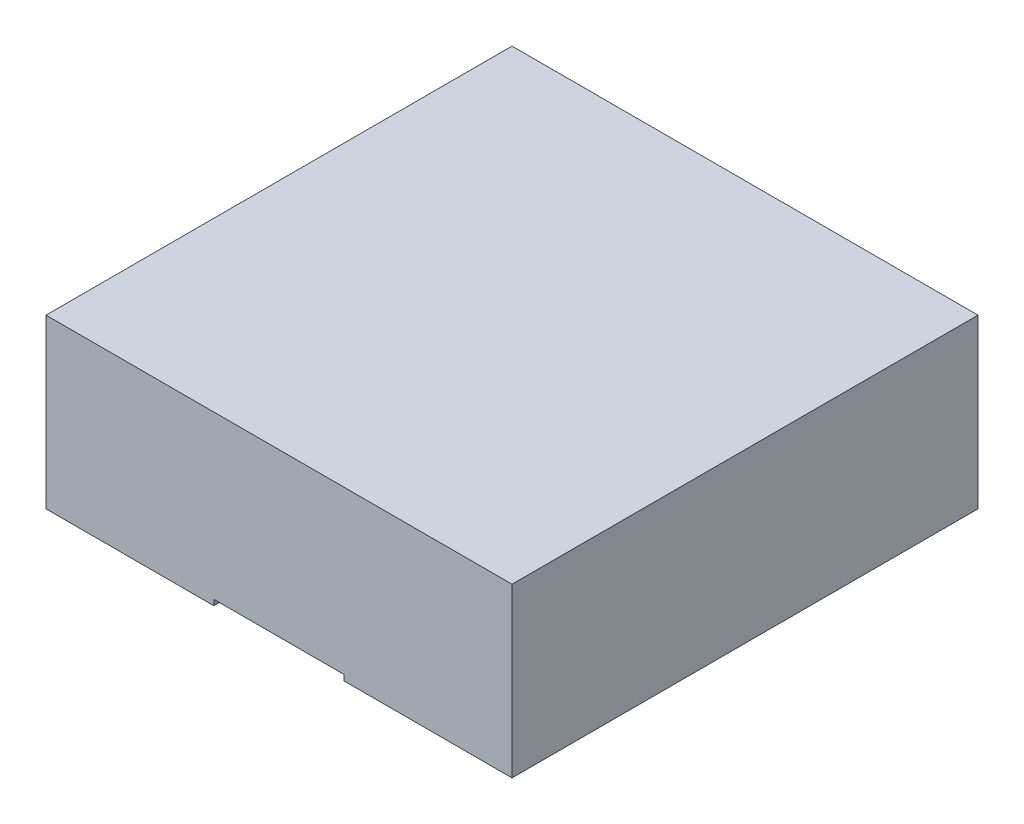
ISO-10303-21;
HEADER;
FILE_DESCRIPTION(('STEP AP214'),'2;1');
FILE_NAME('part.step','',(''),(''),'','','');
FILE_SCHEMA(('AUTOMOTIVE_DESIGN { 1 0 10303 214 1 1 1 1 }'));
ENDSEC;
DATA;
#1=APPLICATION_CONTEXT('core data for automotive mechanical design processes');
#2=APPLICATION_PROTOCOL_DEFINITION('international standard','automotive_design',2000,#1);
#3=PRODUCT_CONTEXT('',#1,'mechanical');
#4=PRODUCT('Part','Part','',(#3));
#5=PRODUCT_RELATED_PRODUCT_CATEGORY('part','',(#4));
#6=PRODUCT_DEFINITION_FORMATION('','',#4);
#7=PRODUCT_DEFINITION_CONTEXT('part definition',#1,'design');
#8=PRODUCT_DEFINITION('design','',#6,#7);
#9=PRODUCT_DEFINITION_SHAPE('','',#8);
#10=(LENGTH_UNIT() NAMED_UNIT(*) SI_UNIT(.MILLI.,.METRE.));
#11=(NAMED_UNIT(*) PLANE_ANGLE_UNIT() SI_UNIT($,.RADIAN.));
#12=(NAMED_UNIT(*) SI_UNIT($,.STERADIAN.) SOLID_ANGLE_UNIT());
#13=UNCERTAINTY_MEASURE_WITH_UNIT(LENGTH_MEASURE(1.E-05),#10,'distance_accuracy_value','');
#14=(GEOMETRIC_REPRESENTATION_CONTEXT(3) GLOBAL_UNCERTAINTY_ASSIGNED_CONTEXT((#13)) GLOBAL_UNIT_ASSIGNED_CONTEXT((#10,
#11,#12)) REPRESENTATION_CONTEXT('',''));
#15=CARTESIAN_POINT('',(0.,0.,0.));
#16=DIRECTION('',(0.,0.,1.));
#17=DIRECTION('',(1.,0.,0.));
#18=AXIS2_PLACEMENT_3D('',#15,#16,#17);
#19=CARTESIAN_POINT('',(12.5,4.5,12.5));
#20=DIRECTION('',(-1.,0.,0.));
#21=DIRECTION('',(0.,0.,1.));
#22=AXIS2_PLACEMENT_3D('',#19,#20,#21);
#23=PLANE('',#22);
#24=DIRECTION('',(0.,0.,-1.));
#25=VECTOR('',#24,1.);
#26=CARTESIAN_POINT('',(12.5,-4.5,12.5));
#27=LINE('',#26,#25);
#28=CARTESIAN_POINT('',(12.5,-4.5,12.5));
#29=VERTEX_POINT('',#28);
#30=CARTESIAN_POINT('',(12.5,-4.5,-12.5));
#31=VERTEX_POINT('',#30);
#32=EDGE_CURVE('E137',#29,#31,#27,.T.);
#33=ORIENTED_EDGE('',*,*,#32,.T.);
#34=DIRECTION('',(0.,-1.,0.));
#35=VECTOR('',#34,1.);
#36=CARTESIAN_POINT('',(12.5,4.5,-12.5));
#37=LINE('',#36,#35);
#38=CARTESIAN_POINT('',(12.5,4.5,-12.5));
#39=VERTEX_POINT('',#38);
#40=EDGE_CURVE('E11',#39,#31,#37,.T.);
#41=ORIENTED_EDGE('',*,*,#40,.F.);
#42=DIRECTION('',(0.,0.,-1.));
#43=VECTOR('',#42,1.);
#44=CARTESIAN_POINT('',(12.5,4.5,12.5));
#45=LINE('',#44,#43);
#46=CARTESIAN_POINT('',(12.5,4.5,12.5));
#47=VERTEX_POINT('',#46);
#48=EDGE_CURVE('E141',#47,#39,#45,.T.);
#49=ORIENTED_EDGE('',*,*,#48,.F.);
#50=DIRECTION('',(0.,-1.,0.));
#51=VECTOR('',#50,1.);
#52=CARTESIAN_POINT('',(12.5,4.5,12.5));
#53=LINE('',#52,#51);
#54=EDGE_CURVE('E148',#47,#29,#53,.T.);
#55=ORIENTED_EDGE('',*,*,#54,.T.);
#56=EDGE_LOOP('',(#33,#41,#49,#55));
#57=FACE_BOUND('',#56,.T.);
#58=ADVANCED_FACE('F33',(#57),#23,.F.);
#59=CARTESIAN_POINT('',(-12.5,4.5,-12.5));
#60=DIRECTION('',(0.,0.,1.));
#61=DIRECTION('',(1.,0.,0.));
#62=AXIS2_PLACEMENT_3D('',#59,#60,#61);
#63=PLANE('',#62);
#64=DIRECTION('',(-1.,0.,0.));
#65=VECTOR('',#64,1.);
#66=CARTESIAN_POINT('',(-12.5,-4.5,-12.5));
#67=LINE('',#66,#65);
#68=CARTESIAN_POINT('',(-12.5,-4.5,-12.5));
#69=VERTEX_POINT('',#68);
#70=EDGE_CURVE('E151',#31,#69,#67,.T.);
#71=ORIENTED_EDGE('',*,*,#70,.T.);
#72=DIRECTION('',(0.,-1.,0.));
#73=VECTOR('',#72,1.);
#74=CARTESIAN_POINT('',(-12.5,4.5,-12.5));
#75=LINE('',#74,#73);
#76=CARTESIAN_POINT('',(-12.5,4.5,-12.5));
#77=VERTEX_POINT('',#76);
#78=EDGE_CURVE('E40',#77,#69,#75,.T.);
#79=ORIENTED_EDGE('',*,*,#78,.F.);
#80=DIRECTION('',(-1.,0.,0.));
#81=VECTOR('',#80,1.);
#82=CARTESIAN_POINT('',(-12.5,4.5,-12.5));
#83=LINE('',#82,#81);
#84=EDGE_CURVE('E84',#39,#77,#83,.T.);
#85=ORIENTED_EDGE('',*,*,#84,.F.);
#86=ORIENTED_EDGE('',*,*,#40,.T.);
#87=EDGE_LOOP('',(#71,#79,#85,#86));
#88=FACE_BOUND('',#87,.T.);
#89=ADVANCED_FACE('F187',(#88),#63,.F.);
#90=CARTESIAN_POINT('',(-12.5,4.5,12.5));
#91=DIRECTION('',(1.,0.,0.));
#92=DIRECTION('',(0.,0.,-1.));
#93=AXIS2_PLACEMENT_3D('',#90,#91,#92);
#94=PLANE('',#93);
#95=DIRECTION('',(0.,0.,1.));
#96=VECTOR('',#95,1.);
#97=CARTESIAN_POINT('',(-12.5,-4.5,12.5));
#98=LINE('',#97,#96);
#99=CARTESIAN_POINT('',(-12.5,-4.5,12.5));
#100=VERTEX_POINT('',#99);
#101=EDGE_CURVE('E153',#69,#100,#98,.T.);
#102=ORIENTED_EDGE('',*,*,#101,.T.);
#103=DIRECTION('',(0.,-1.,0.));
#104=VECTOR('',#103,1.);
#105=CARTESIAN_POINT('',(-12.5,4.5,12.5));
#106=LINE('',#105,#104);
#107=CARTESIAN_POINT('',(-12.5,4.5,12.5));
#108=VERTEX_POINT('',#107);
#109=EDGE_CURVE('E158',#108,#100,#106,.T.);
#110=ORIENTED_EDGE('',*,*,#109,.F.);
#111=DIRECTION('',(0.,0.,1.));
#112=VECTOR('',#111,1.);
#113=CARTESIAN_POINT('',(-12.5,4.5,12.5));
#114=LINE('',#113,#112);
#115=EDGE_CURVE('E145',#77,#108,#114,.T.);
#116=ORIENTED_EDGE('',*,*,#115,.F.);
#117=ORIENTED_EDGE('',*,*,#78,.T.);
#118=EDGE_LOOP('',(#102,#110,#116,#117));
#119=FACE_BOUND('',#118,.T.);
#120=ADVANCED_FACE('F164',(#119),#94,.F.);
#121=CARTESIAN_POINT('',(-12.5,4.5,12.5));
#122=DIRECTION('',(0.,0.,-1.));
#123=DIRECTION('',(-1.,0.,0.));
#124=AXIS2_PLACEMENT_3D('',#121,#122,#123);
#125=PLANE('',#124);
#126=DIRECTION('',(1.,0.,0.));
#127=VECTOR('',#126,1.);
#128=CARTESIAN_POINT('',(-12.5,-4.5,12.5));
#129=LINE('',#128,#127);
#130=CARTESIAN_POINT('',(-3.5,-4.5,12.5));
#131=VERTEX_POINT('',#130);
#132=EDGE_CURVE('E143',#100,#131,#129,.T.);
#133=ORIENTED_EDGE('',*,*,#132,.T.);
#134=DIRECTION('',(0.,-1.,0.));
#135=VECTOR('',#134,1.);
#136=CARTESIAN_POINT('',(-3.5,-4.2,12.5));
#137=LINE('',#136,#135);
#138=CARTESIAN_POINT('',(-3.5,-4.2,12.5));
#139=VERTEX_POINT('',#138);
#140=EDGE_CURVE('E135',#139,#131,#137,.T.);
#141=ORIENTED_EDGE('',*,*,#140,.F.);
#142=DIRECTION('',(-1.,0.,0.));
#143=VECTOR('',#142,1.);
#144=CARTESIAN_POINT('',(-3.5,-4.2,12.5));
#145=LINE('',#144,#143);
#146=CARTESIAN_POINT('',(3.5,-4.2,12.5));
#147=VERTEX_POINT('',#146);
#148=EDGE_CURVE('E113',#147,#139,#145,.T.);
#149=ORIENTED_EDGE('',*,*,#148,.F.);
#150=DIRECTION('',(0.,-1.,0.));
#151=VECTOR('',#150,1.);
#152=CARTESIAN_POINT('',(3.5,-4.2,12.5));
#153=LINE('',#152,#151);
#154=CARTESIAN_POINT('',(3.5,-4.5,12.5));
#155=VERTEX_POINT('',#154);
#156=EDGE_CURVE('E138',#147,#155,#153,.T.);
#157=ORIENTED_EDGE('',*,*,#156,.T.);
#158=EDGE_CURVE('E77',#155,#29,#129,.T.);
#159=ORIENTED_EDGE('',*,*,#158,.T.);
#160=ORIENTED_EDGE('',*,*,#54,.F.);
#161=DIRECTION('',(1.,0.,0.));
#162=VECTOR('',#161,1.);
#163=CARTESIAN_POINT('',(-12.5,4.5,12.5));
#164=LINE('',#163,#162);
#165=EDGE_CURVE('E56',#108,#47,#164,.T.);
#166=ORIENTED_EDGE('',*,*,#165,.F.);
#167=ORIENTED_EDGE('',*,*,#109,.T.);
#168=EDGE_LOOP('',(#133,#141,#149,#157,#159,#160,#166,#167));
#169=FACE_BOUND('',#168,.T.);
#170=ADVANCED_FACE('F170',(#169),#125,.F.);
#171=CARTESIAN_POINT('',(0.,4.5,0.));
#172=DIRECTION('',(0.,-1.,0.));
#173=DIRECTION('',(0.,0.,-1.));
#174=AXIS2_PLACEMENT_3D('',#171,#172,#173);
#175=PLANE('',#174);
#176=ORIENTED_EDGE('',*,*,#48,.T.);
#177=ORIENTED_EDGE('',*,*,#84,.T.);
#178=ORIENTED_EDGE('',*,*,#115,.T.);
#179=ORIENTED_EDGE('',*,*,#165,.T.);
#180=EDGE_LOOP('',(#176,#177,#178,#179));
#181=FACE_BOUND('',#180,.T.);
#182=ADVANCED_FACE('F174',(#181),#175,.F.);
#183=CARTESIAN_POINT('',(0.,-4.5,0.));
#184=DIRECTION('',(0.,-1.,0.));
#185=DIRECTION('',(0.,0.,-1.));
#186=AXIS2_PLACEMENT_3D('',#183,#184,#185);
#187=PLANE('',#186);
#188=DIRECTION('',(0.,0.,-1.));
#189=VECTOR('',#188,1.);
#190=CARTESIAN_POINT('',(-3.5,-4.5,12.5));
#191=LINE('',#190,#189);
#192=CARTESIAN_POINT('',(-3.5,-4.5,-4.));
#193=VERTEX_POINT('',#192);
#194=EDGE_CURVE('E47',#131,#193,#191,.T.);
#195=ORIENTED_EDGE('',*,*,#194,.F.);
#196=ORIENTED_EDGE('',*,*,#132,.F.);
#197=ORIENTED_EDGE('',*,*,#101,.F.);
#198=ORIENTED_EDGE('',*,*,#70,.F.);
#199=ORIENTED_EDGE('',*,*,#32,.F.);
#200=ORIENTED_EDGE('',*,*,#158,.F.);
#201=DIRECTION('',(0.,0.,1.));
#202=VECTOR('',#201,1.);
#203=CARTESIAN_POINT('',(3.5,-4.5,12.5));
#204=LINE('',#203,#202);
#205=CARTESIAN_POINT('',(3.5,-4.5,-4.));
#206=VERTEX_POINT('',#205);
#207=EDGE_CURVE('E126',#206,#155,#204,.T.);
#208=ORIENTED_EDGE('',*,*,#207,.F.);
#209=DIRECTION('',(1.,0.,0.));
#210=VECTOR('',#209,1.);
#211=CARTESIAN_POINT('',(-3.5,-4.5,-4.));
#212=LINE('',#211,#210);
#213=EDGE_CURVE('E128',#193,#206,#212,.T.);
#214=ORIENTED_EDGE('',*,*,#213,.F.);
#215=EDGE_LOOP('',(#195,#196,#197,#198,#199,#200,#208,#214));
#216=FACE_BOUND('',#215,.T.);
#217=ADVANCED_FACE('F168',(#216),#187,.T.);
#218=CARTESIAN_POINT('',(-3.5,-4.2,12.5));
#219=DIRECTION('',(-1.,0.,0.));
#220=DIRECTION('',(0.,0.,1.));
#221=AXIS2_PLACEMENT_3D('',#218,#219,#220);
#222=PLANE('',#221);
#223=ORIENTED_EDGE('',*,*,#194,.T.);
#224=DIRECTION('',(0.,-1.,0.));
#225=VECTOR('',#224,1.);
#226=CARTESIAN_POINT('',(-3.5,-4.2,-4.));
#227=LINE('',#226,#225);
#228=CARTESIAN_POINT('',(-3.5,-4.2,-4.));
#229=VERTEX_POINT('',#228);
#230=EDGE_CURVE('E103',#229,#193,#227,.T.);
#231=ORIENTED_EDGE('',*,*,#230,.F.);
#232=DIRECTION('',(0.,0.,-1.));
#233=VECTOR('',#232,1.);
#234=CARTESIAN_POINT('',(-3.5,-4.2,12.5));
#235=LINE('',#234,#233);
#236=EDGE_CURVE('E107',#139,#229,#235,.T.);
#237=ORIENTED_EDGE('',*,*,#236,.F.);
#238=ORIENTED_EDGE('',*,*,#140,.T.);
#239=EDGE_LOOP('',(#223,#231,#237,#238));
#240=FACE_BOUND('',#239,.T.);
#241=ADVANCED_FACE('F105',(#240),#222,.F.);
#242=CARTESIAN_POINT('',(3.5,-4.2,12.5));
#243=DIRECTION('',(1.,0.,0.));
#244=DIRECTION('',(0.,0.,-1.));
#245=AXIS2_PLACEMENT_3D('',#242,#243,#244);
#246=PLANE('',#245);
#247=ORIENTED_EDGE('',*,*,#207,.T.);
#248=ORIENTED_EDGE('',*,*,#156,.F.);
#249=DIRECTION('',(0.,0.,1.));
#250=VECTOR('',#249,1.);
#251=CARTESIAN_POINT('',(3.5,-4.2,12.5));
#252=LINE('',#251,#250);
#253=CARTESIAN_POINT('',(3.5,-4.2,-4.));
#254=VERTEX_POINT('',#253);
#255=EDGE_CURVE('E121',#254,#147,#252,.T.);
#256=ORIENTED_EDGE('',*,*,#255,.F.);
#257=DIRECTION('',(0.,-1.,0.));
#258=VECTOR('',#257,1.);
#259=CARTESIAN_POINT('',(3.5,-4.2,-4.));
#260=LINE('',#259,#258);
#261=EDGE_CURVE('E112',#254,#206,#260,.T.);
#262=ORIENTED_EDGE('',*,*,#261,.T.);
#263=EDGE_LOOP('',(#247,#248,#256,#262));
#264=FACE_BOUND('',#263,.T.);
#265=ADVANCED_FACE('F197',(#264),#246,.F.);
#266=CARTESIAN_POINT('',(-3.5,-4.2,-4.));
#267=DIRECTION('',(0.,0.,-1.));
#268=DIRECTION('',(-1.,0.,0.));
#269=AXIS2_PLACEMENT_3D('',#266,#267,#268);
#270=PLANE('',#269);
#271=ORIENTED_EDGE('',*,*,#213,.T.);
#272=ORIENTED_EDGE('',*,*,#261,.F.);
#273=DIRECTION('',(1.,0.,0.));
#274=VECTOR('',#273,1.);
#275=CARTESIAN_POINT('',(-3.5,-4.2,-4.));
#276=LINE('',#275,#274);
#277=EDGE_CURVE('E116',#229,#254,#276,.T.);
#278=ORIENTED_EDGE('',*,*,#277,.F.);
#279=ORIENTED_EDGE('',*,*,#230,.T.);
#280=EDGE_LOOP('',(#271,#272,#278,#279));
#281=FACE_BOUND('',#280,.T.);
#282=ADVANCED_FACE('F117',(#281),#270,.F.);
#283=CARTESIAN_POINT('',(0.,-4.2,0.));
#284=DIRECTION('',(0.,-1.,0.));
#285=DIRECTION('',(0.,0.,-1.));
#286=AXIS2_PLACEMENT_3D('',#283,#284,#285);
#287=PLANE('',#286);
#288=ORIENTED_EDGE('',*,*,#236,.T.);
#289=ORIENTED_EDGE('',*,*,#277,.T.);
#290=ORIENTED_EDGE('',*,*,#255,.T.);
#291=ORIENTED_EDGE('',*,*,#148,.T.);
#292=EDGE_LOOP('',(#288,#289,#290,#291));
#293=FACE_BOUND('',#292,.T.);
#294=ADVANCED_FACE('F123',(#293),#287,.T.);
#295=CLOSED_SHELL('',(#58,#89,#120,#170,#182,#217,#241,#265,#282,#294));
#296=MANIFOLD_SOLID_BREP('B2',#295);
#297=ADVANCED_BREP_SHAPE_REPRESENTATION('',(#18,#296),#14);
#298=SHAPE_DEFINITION_REPRESENTATION(#9,#297);
ENDSEC;
END-ISO-10303-21;
